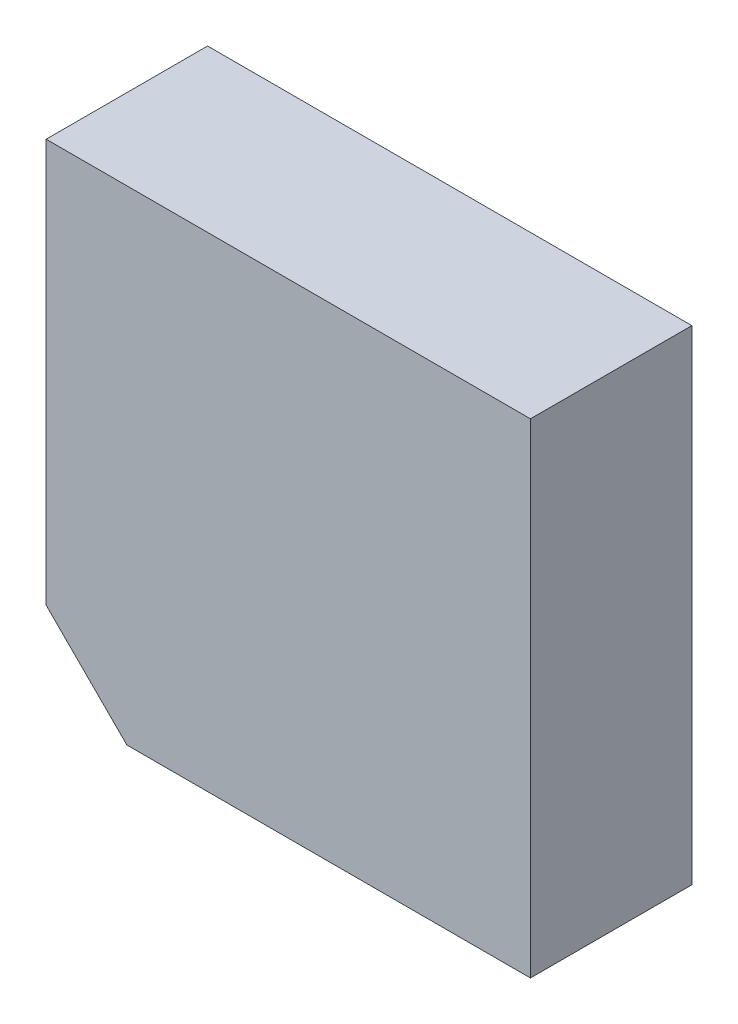
ISO-10303-21;
HEADER;
FILE_DESCRIPTION(('STEP AP214'),'2;1');
FILE_NAME('part.step','',(''),(''),'','','');
FILE_SCHEMA(('AUTOMOTIVE_DESIGN { 1 0 10303 214 1 1 1 1 }'));
ENDSEC;
DATA;
#1=APPLICATION_CONTEXT('core data for automotive mechanical design processes');
#2=APPLICATION_PROTOCOL_DEFINITION('international standard','automotive_design',2000,#1);
#3=PRODUCT_CONTEXT('',#1,'mechanical');
#4=PRODUCT('Part','Part','',(#3));
#5=PRODUCT_RELATED_PRODUCT_CATEGORY('part','',(#4));
#6=PRODUCT_DEFINITION_FORMATION('','',#4);
#7=PRODUCT_DEFINITION_CONTEXT('part definition',#1,'design');
#8=PRODUCT_DEFINITION('design','',#6,#7);
#9=PRODUCT_DEFINITION_SHAPE('','',#8);
#10=(LENGTH_UNIT() NAMED_UNIT(*) SI_UNIT(.MILLI.,.METRE.));
#11=(NAMED_UNIT(*) PLANE_ANGLE_UNIT() SI_UNIT($,.RADIAN.));
#12=(NAMED_UNIT(*) SI_UNIT($,.STERADIAN.) SOLID_ANGLE_UNIT());
#13=UNCERTAINTY_MEASURE_WITH_UNIT(LENGTH_MEASURE(1.E-05),#10,'distance_accuracy_value','');
#14=(GEOMETRIC_REPRESENTATION_CONTEXT(3) GLOBAL_UNCERTAINTY_ASSIGNED_CONTEXT((#13)) GLOBAL_UNIT_ASSIGNED_CONTEXT((#10,
#11,#12)) REPRESENTATION_CONTEXT('',''));
#15=CARTESIAN_POINT('',(0.,0.,0.));
#16=DIRECTION('',(0.,0.,1.));
#17=DIRECTION('',(1.,0.,0.));
#18=AXIS2_PLACEMENT_3D('',#15,#16,#17);
#19=CARTESIAN_POINT('',(-3.75000012,3.75000012,2.50000008));
#20=DIRECTION('',(0.,0.,1.));
#21=DIRECTION('',(1.,0.,0.));
#22=AXIS2_PLACEMENT_3D('',#19,#20,#21);
#23=PLANE('',#22);
#24=DIRECTION('',(0.,1.,0.));
#25=VECTOR('',#24,1.);
#26=CARTESIAN_POINT('',(3.75000012,3.75000012,2.50000008));
#27=LINE('',#26,#25);
#28=CARTESIAN_POINT('',(3.75000012,3.75000012,2.50000008));
#29=VERTEX_POINT('',#28);
#30=CARTESIAN_POINT('',(3.75000012,-3.75000012,2.50000008));
#31=VERTEX_POINT('',#30);
#32=EDGE_CURVE('E86',#29,#31,#27,.F.);
#33=ORIENTED_EDGE('',*,*,#32,.F.);
#34=DIRECTION('',(1.,0.,0.));
#35=VECTOR('',#34,1.);
#36=CARTESIAN_POINT('',(-3.75000012,3.75000012,2.50000008));
#37=LINE('',#36,#35);
#38=CARTESIAN_POINT('',(-3.75000012,3.75000012,2.50000008));
#39=VERTEX_POINT('',#38);
#40=EDGE_CURVE('E75',#39,#29,#37,.T.);
#41=ORIENTED_EDGE('',*,*,#40,.F.);
#42=DIRECTION('',(0.,1.,0.));
#43=VECTOR('',#42,1.);
#44=CARTESIAN_POINT('',(-3.75000012,-2.50000008,2.50000008));
#45=LINE('',#44,#43);
#46=CARTESIAN_POINT('',(-3.75000012,-2.50000008,2.50000008));
#47=VERTEX_POINT('',#46);
#48=EDGE_CURVE('E19',#47,#39,#45,.T.);
#49=ORIENTED_EDGE('',*,*,#48,.F.);
#50=DIRECTION('',(0.707106781186548,-0.707106781186548,0.));
#51=VECTOR('',#50,1.);
#52=CARTESIAN_POINT('',(-2.50000008,-3.75000012,2.50000008));
#53=LINE('',#52,#51);
#54=CARTESIAN_POINT('',(-2.50000008,-3.75000012,2.50000008));
#55=VERTEX_POINT('',#54);
#56=EDGE_CURVE('E64',#55,#47,#53,.F.);
#57=ORIENTED_EDGE('',*,*,#56,.F.);
#58=DIRECTION('',(1.,0.,0.));
#59=VECTOR('',#58,1.);
#60=CARTESIAN_POINT('',(3.75000012,-3.75000012,2.50000008));
#61=LINE('',#60,#59);
#62=EDGE_CURVE('E59',#31,#55,#61,.F.);
#63=ORIENTED_EDGE('',*,*,#62,.F.);
#64=EDGE_LOOP('',(#33,#41,#49,#57,#63));
#65=FACE_BOUND('',#64,.T.);
#66=ADVANCED_FACE('F16',(#65),#23,.T.);
#67=CARTESIAN_POINT('',(-3.75000012,-2.50000008,0.));
#68=DIRECTION('',(-1.,0.,0.));
#69=DIRECTION('',(0.,0.,1.));
#70=AXIS2_PLACEMENT_3D('',#67,#68,#69);
#71=PLANE('',#70);
#72=DIRECTION('',(0.,0.,1.));
#73=VECTOR('',#72,1.);
#74=CARTESIAN_POINT('',(-3.75000012,3.75000012,0.));
#75=LINE('',#74,#73);
#76=CARTESIAN_POINT('',(-3.75000012,3.75000012,0.));
#77=VERTEX_POINT('',#76);
#78=EDGE_CURVE('E90',#77,#39,#75,.T.);
#79=ORIENTED_EDGE('',*,*,#78,.F.);
#80=DIRECTION('',(0.,1.,0.));
#81=VECTOR('',#80,1.);
#82=CARTESIAN_POINT('',(-3.75000012,3.75000012,0.));
#83=LINE('',#82,#81);
#84=CARTESIAN_POINT('',(-3.75000012,-2.50000008,0.));
#85=VERTEX_POINT('',#84);
#86=EDGE_CURVE('E81',#77,#85,#83,.F.);
#87=ORIENTED_EDGE('',*,*,#86,.T.);
#88=DIRECTION('',(0.,0.,1.));
#89=VECTOR('',#88,1.);
#90=CARTESIAN_POINT('',(-3.75000012,-2.50000008,0.));
#91=LINE('',#90,#89);
#92=EDGE_CURVE('E69',#47,#85,#91,.F.);
#93=ORIENTED_EDGE('',*,*,#92,.F.);
#94=ORIENTED_EDGE('',*,*,#48,.T.);
#95=EDGE_LOOP('',(#79,#87,#93,#94));
#96=FACE_BOUND('',#95,.T.);
#97=ADVANCED_FACE('F80',(#96),#71,.T.);
#98=CARTESIAN_POINT('',(-2.50000008,-3.75000012,0.));
#99=DIRECTION('',(-0.707106781186548,-0.707106781186548,0.));
#100=DIRECTION('',(0.707106781186548,-0.707106781186548,0.));
#101=AXIS2_PLACEMENT_3D('',#98,#99,#100);
#102=PLANE('',#101);
#103=ORIENTED_EDGE('',*,*,#92,.T.);
#104=DIRECTION('',(0.707106781186548,-0.707106781186548,0.));
#105=VECTOR('',#104,1.);
#106=CARTESIAN_POINT('',(-3.75000012,-2.50000008,0.));
#107=LINE('',#106,#105);
#108=CARTESIAN_POINT('',(-2.50000008,-3.75000012,0.));
#109=VERTEX_POINT('',#108);
#110=EDGE_CURVE('E95',#85,#109,#107,.T.);
#111=ORIENTED_EDGE('',*,*,#110,.T.);
#112=DIRECTION('',(0.,0.,-1.));
#113=VECTOR('',#112,1.);
#114=CARTESIAN_POINT('',(-2.50000008,-3.75000012,0.));
#115=LINE('',#114,#113);
#116=EDGE_CURVE('E71',#55,#109,#115,.T.);
#117=ORIENTED_EDGE('',*,*,#116,.F.);
#118=ORIENTED_EDGE('',*,*,#56,.T.);
#119=EDGE_LOOP('',(#103,#111,#117,#118));
#120=FACE_BOUND('',#119,.T.);
#121=ADVANCED_FACE('F66',(#120),#102,.T.);
#122=CARTESIAN_POINT('',(3.75000012,-3.75000012,0.));
#123=DIRECTION('',(0.,-1.,0.));
#124=DIRECTION('',(0.,0.,-1.));
#125=AXIS2_PLACEMENT_3D('',#122,#123,#124);
#126=PLANE('',#125);
#127=ORIENTED_EDGE('',*,*,#116,.T.);
#128=DIRECTION('',(1.,0.,0.));
#129=VECTOR('',#128,1.);
#130=CARTESIAN_POINT('',(-3.75000012,-3.75000012,0.));
#131=LINE('',#130,#129);
#132=CARTESIAN_POINT('',(3.75000012,-3.75000012,0.));
#133=VERTEX_POINT('',#132);
#134=EDGE_CURVE('E97',#109,#133,#131,.T.);
#135=ORIENTED_EDGE('',*,*,#134,.T.);
#136=DIRECTION('',(0.,0.,-1.));
#137=VECTOR('',#136,1.);
#138=CARTESIAN_POINT('',(3.75000012,-3.75000012,0.));
#139=LINE('',#138,#137);
#140=EDGE_CURVE('E88',#31,#133,#139,.T.);
#141=ORIENTED_EDGE('',*,*,#140,.F.);
#142=ORIENTED_EDGE('',*,*,#62,.T.);
#143=EDGE_LOOP('',(#127,#135,#141,#142));
#144=FACE_BOUND('',#143,.T.);
#145=ADVANCED_FACE('F107',(#144),#126,.T.);
#146=CARTESIAN_POINT('',(3.75000012,3.75000012,0.));
#147=DIRECTION('',(1.,0.,0.));
#148=DIRECTION('',(0.,0.,-1.));
#149=AXIS2_PLACEMENT_3D('',#146,#147,#148);
#150=PLANE('',#149);
#151=ORIENTED_EDGE('',*,*,#140,.T.);
#152=DIRECTION('',(0.,1.,0.));
#153=VECTOR('',#152,1.);
#154=CARTESIAN_POINT('',(3.75000012,3.75000012,0.));
#155=LINE('',#154,#153);
#156=CARTESIAN_POINT('',(3.75000012,3.75000012,0.));
#157=VERTEX_POINT('',#156);
#158=EDGE_CURVE('E25',#133,#157,#155,.T.);
#159=ORIENTED_EDGE('',*,*,#158,.T.);
#160=DIRECTION('',(0.,0.,1.));
#161=VECTOR('',#160,1.);
#162=CARTESIAN_POINT('',(3.75000012,3.75000012,0.));
#163=LINE('',#162,#161);
#164=EDGE_CURVE('E33',#29,#157,#163,.F.);
#165=ORIENTED_EDGE('',*,*,#164,.F.);
#166=ORIENTED_EDGE('',*,*,#32,.T.);
#167=EDGE_LOOP('',(#151,#159,#165,#166));
#168=FACE_BOUND('',#167,.T.);
#169=ADVANCED_FACE('F103',(#168),#150,.T.);
#170=CARTESIAN_POINT('',(-3.75000012,3.75000012,0.));
#171=DIRECTION('',(0.,1.,0.));
#172=DIRECTION('',(0.,0.,1.));
#173=AXIS2_PLACEMENT_3D('',#170,#171,#172);
#174=PLANE('',#173);
#175=ORIENTED_EDGE('',*,*,#164,.T.);
#176=DIRECTION('',(1.,0.,0.));
#177=VECTOR('',#176,1.);
#178=CARTESIAN_POINT('',(-3.75000012,3.75000012,0.));
#179=LINE('',#178,#177);
#180=EDGE_CURVE('E11',#157,#77,#179,.F.);
#181=ORIENTED_EDGE('',*,*,#180,.T.);
#182=ORIENTED_EDGE('',*,*,#78,.T.);
#183=ORIENTED_EDGE('',*,*,#40,.T.);
#184=EDGE_LOOP('',(#175,#181,#182,#183));
#185=FACE_BOUND('',#184,.T.);
#186=ADVANCED_FACE('F115',(#185),#174,.T.);
#187=CARTESIAN_POINT('',(-3.75000012,3.75000012,0.));
#188=DIRECTION('',(0.,0.,1.));
#189=DIRECTION('',(1.,0.,0.));
#190=AXIS2_PLACEMENT_3D('',#187,#188,#189);
#191=PLANE('',#190);
#192=ORIENTED_EDGE('',*,*,#158,.F.);
#193=ORIENTED_EDGE('',*,*,#134,.F.);
#194=ORIENTED_EDGE('',*,*,#110,.F.);
#195=ORIENTED_EDGE('',*,*,#86,.F.);
#196=ORIENTED_EDGE('',*,*,#180,.F.);
#197=EDGE_LOOP('',(#192,#193,#194,#195,#196));
#198=FACE_BOUND('',#197,.T.);
#199=ADVANCED_FACE('F106',(#198),#191,.F.);
#200=CLOSED_SHELL('',(#66,#97,#121,#145,#169,#186,#199));
#201=MANIFOLD_SOLID_BREP('B1',#200);
#202=ADVANCED_BREP_SHAPE_REPRESENTATION('',(#18,#201),#14);
#203=SHAPE_DEFINITION_REPRESENTATION(#9,#202);
ENDSEC;
END-ISO-10303-21;
